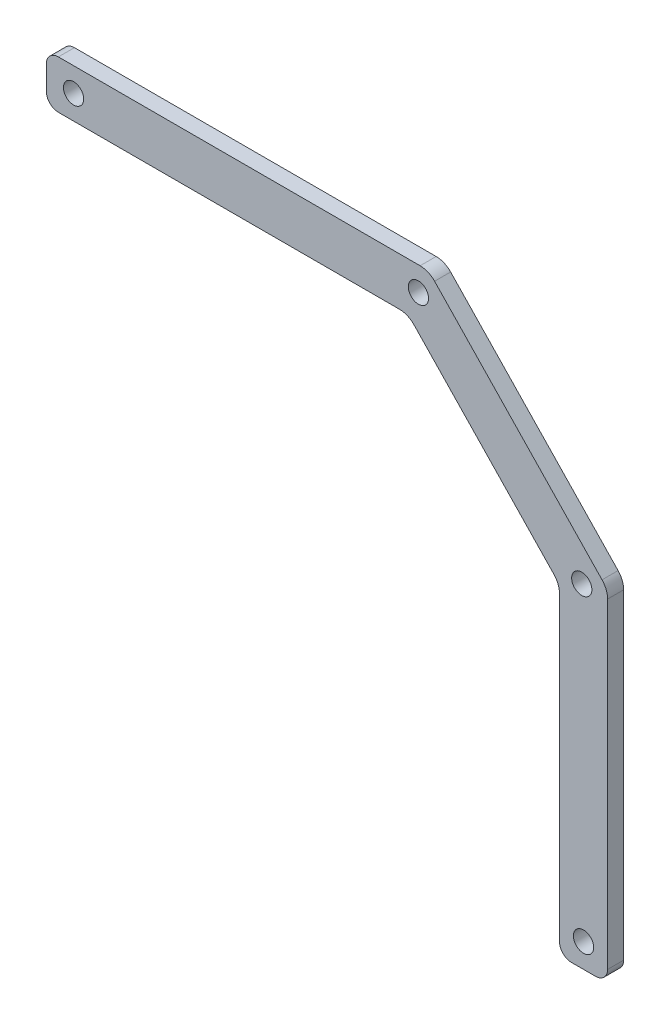
ISO-10303-21;
HEADER;
FILE_DESCRIPTION(('STEP AP214'),'2;1');
FILE_NAME('part.step','',(''),(''),'','','');
FILE_SCHEMA(('AUTOMOTIVE_DESIGN { 1 0 10303 214 1 1 1 1 }'));
ENDSEC;
DATA;
#1=APPLICATION_CONTEXT('core data for automotive mechanical design processes');
#2=APPLICATION_PROTOCOL_DEFINITION('international standard','automotive_design',2000,#1);
#3=PRODUCT_CONTEXT('',#1,'mechanical');
#4=PRODUCT('Part','Part','',(#3));
#5=PRODUCT_RELATED_PRODUCT_CATEGORY('part','',(#4));
#6=PRODUCT_DEFINITION_FORMATION('','',#4);
#7=PRODUCT_DEFINITION_CONTEXT('part definition',#1,'design');
#8=PRODUCT_DEFINITION('design','',#6,#7);
#9=PRODUCT_DEFINITION_SHAPE('','',#8);
#10=(LENGTH_UNIT() NAMED_UNIT(*) SI_UNIT(.MILLI.,.METRE.));
#11=(NAMED_UNIT(*) PLANE_ANGLE_UNIT() SI_UNIT($,.RADIAN.));
#12=(NAMED_UNIT(*) SI_UNIT($,.STERADIAN.) SOLID_ANGLE_UNIT());
#13=UNCERTAINTY_MEASURE_WITH_UNIT(LENGTH_MEASURE(1.E-05),#10,'distance_accuracy_value','');
#14=(GEOMETRIC_REPRESENTATION_CONTEXT(3) GLOBAL_UNCERTAINTY_ASSIGNED_CONTEXT((#13)) GLOBAL_UNIT_ASSIGNED_CONTEXT((#10,
#11,#12)) REPRESENTATION_CONTEXT('',''));
#15=CARTESIAN_POINT('',(0.,0.,0.));
#16=DIRECTION('',(0.,0.,1.));
#17=DIRECTION('',(1.,0.,0.));
#18=AXIS2_PLACEMENT_3D('',#15,#16,#17);
#19=CARTESIAN_POINT('',(70.,-70.,2.));
#20=DIRECTION('',(-1.,0.,0.));
#21=DIRECTION('',(0.,0.,1.));
#22=AXIS2_PLACEMENT_3D('',#19,#20,#21);
#23=PLANE('',#22);
#24=DIRECTION('',(0.,1.,0.));
#25=VECTOR('',#24,1.);
#26=CARTESIAN_POINT('',(70.,-70.,-2.));
#27=LINE('',#26,#25);
#28=CARTESIAN_POINT('',(70.,-67.,-2.));
#29=VERTEX_POINT('',#28);
#30=CARTESIAN_POINT('',(70.,13.0065551866887,-2.));
#31=VERTEX_POINT('',#30);
#32=EDGE_CURVE('E184',#29,#31,#27,.T.);
#33=ORIENTED_EDGE('',*,*,#32,.T.);
#34=DIRECTION('',(0.,0.,-1.));
#35=VECTOR('',#34,1.);
#36=CARTESIAN_POINT('',(70.,13.0065551866887,2.));
#37=LINE('',#36,#35);
#38=CARTESIAN_POINT('',(70.,13.0065551866887,2.));
#39=VERTEX_POINT('',#38);
#40=EDGE_CURVE('E52',#31,#39,#37,.F.);
#41=ORIENTED_EDGE('',*,*,#40,.T.);
#42=DIRECTION('',(0.,1.,0.));
#43=VECTOR('',#42,1.);
#44=CARTESIAN_POINT('',(70.,-70.,2.));
#45=LINE('',#44,#43);
#46=CARTESIAN_POINT('',(70.,-67.,2.));
#47=VERTEX_POINT('',#46);
#48=EDGE_CURVE('E178',#47,#39,#45,.T.);
#49=ORIENTED_EDGE('',*,*,#48,.F.);
#50=DIRECTION('',(0.,0.,-1.));
#51=VECTOR('',#50,1.);
#52=CARTESIAN_POINT('',(70.,-67.,2.));
#53=LINE('',#52,#51);
#54=EDGE_CURVE('E224',#47,#29,#53,.T.);
#55=ORIENTED_EDGE('',*,*,#54,.T.);
#56=EDGE_LOOP('',(#33,#41,#49,#55));
#57=FACE_BOUND('',#56,.T.);
#58=ADVANCED_FACE('F37',(#57),#23,.F.);
#59=CARTESIAN_POINT('',(-70.,-70.,2.));
#60=DIRECTION('',(1.,0.,0.));
#61=DIRECTION('',(0.,0.,-1.));
#62=AXIS2_PLACEMENT_3D('',#59,#60,#61);
#63=PLANE('',#62);
#64=DIRECTION('',(0.,-1.,0.));
#65=VECTOR('',#64,1.);
#66=CARTESIAN_POINT('',(-70.,-70.,2.));
#67=LINE('',#66,#65);
#68=CARTESIAN_POINT('',(-70.,58.6226510998345,2.));
#69=VERTEX_POINT('',#68);
#70=CARTESIAN_POINT('',(-70.,52.6500248397377,2.));
#71=VERTEX_POINT('',#70);
#72=EDGE_CURVE('E181',#69,#71,#67,.T.);
#73=ORIENTED_EDGE('',*,*,#72,.F.);
#74=DIRECTION('',(0.,0.,-1.));
#75=VECTOR('',#74,1.);
#76=CARTESIAN_POINT('',(-70.,58.6226510998345,-2.));
#77=LINE('',#76,#75);
#78=CARTESIAN_POINT('',(-70.,58.6226510998345,-2.));
#79=VERTEX_POINT('',#78);
#80=EDGE_CURVE('E229',#69,#79,#77,.T.);
#81=ORIENTED_EDGE('',*,*,#80,.T.);
#82=DIRECTION('',(0.,-1.,0.));
#83=VECTOR('',#82,1.);
#84=CARTESIAN_POINT('',(-70.,-70.,-2.));
#85=LINE('',#84,#83);
#86=CARTESIAN_POINT('',(-70.,52.6500248397377,-2.));
#87=VERTEX_POINT('',#86);
#88=EDGE_CURVE('E179',#79,#87,#85,.T.);
#89=ORIENTED_EDGE('',*,*,#88,.T.);
#90=DIRECTION('',(0.,0.,-1.));
#91=VECTOR('',#90,1.);
#92=CARTESIAN_POINT('',(-70.,52.6500248397377,2.));
#93=LINE('',#92,#91);
#94=EDGE_CURVE('E227',#87,#71,#93,.F.);
#95=ORIENTED_EDGE('',*,*,#94,.T.);
#96=EDGE_LOOP('',(#73,#81,#89,#95));
#97=FACE_BOUND('',#96,.T.);
#98=ADVANCED_FACE('F339',(#97),#63,.F.);
#99=CARTESIAN_POINT('',(-70.,-70.,2.));
#100=DIRECTION('',(0.,1.,0.));
#101=DIRECTION('',(0.,0.,1.));
#102=AXIS2_PLACEMENT_3D('',#99,#100,#101);
#103=PLANE('',#102);
#104=DIRECTION('',(1.,0.,0.));
#105=VECTOR('',#104,1.);
#106=CARTESIAN_POINT('',(-70.,-70.,2.));
#107=LINE('',#106,#105);
#108=CARTESIAN_POINT('',(61.,-70.,2.));
#109=VERTEX_POINT('',#108);
#110=CARTESIAN_POINT('',(67.,-70.,2.));
#111=VERTEX_POINT('',#110);
#112=EDGE_CURVE('E172',#109,#111,#107,.T.);
#113=ORIENTED_EDGE('',*,*,#112,.F.);
#114=DIRECTION('',(0.,0.,-1.));
#115=VECTOR('',#114,1.);
#116=CARTESIAN_POINT('',(61.,-70.,-2.));
#117=LINE('',#116,#115);
#118=CARTESIAN_POINT('',(61.,-70.,-2.));
#119=VERTEX_POINT('',#118);
#120=EDGE_CURVE('E157',#109,#119,#117,.T.);
#121=ORIENTED_EDGE('',*,*,#120,.T.);
#122=DIRECTION('',(1.,0.,0.));
#123=VECTOR('',#122,1.);
#124=CARTESIAN_POINT('',(-70.,-70.,-2.));
#125=LINE('',#124,#123);
#126=CARTESIAN_POINT('',(67.,-70.,-2.));
#127=VERTEX_POINT('',#126);
#128=EDGE_CURVE('E169',#119,#127,#125,.T.);
#129=ORIENTED_EDGE('',*,*,#128,.T.);
#130=DIRECTION('',(0.,0.,-1.));
#131=VECTOR('',#130,1.);
#132=CARTESIAN_POINT('',(67.,-70.,2.));
#133=LINE('',#132,#131);
#134=EDGE_CURVE('E173',#127,#111,#133,.F.);
#135=ORIENTED_EDGE('',*,*,#134,.T.);
#136=EDGE_LOOP('',(#113,#121,#129,#135));
#137=FACE_BOUND('',#136,.T.);
#138=ADVANCED_FACE('F168',(#137),#103,.F.);
#139=CARTESIAN_POINT('',(0.,0.,2.));
#140=DIRECTION('',(0.,0.,-1.));
#141=DIRECTION('',(-1.,0.,0.));
#142=AXIS2_PLACEMENT_3D('',#139,#140,#141);
#143=PLANE('',#142);
#144=CARTESIAN_POINT('',(63.5511898929703,13.0736254743437,2.));
#145=DIRECTION('',(0.,0.,-1.));
#146=DIRECTION('',(-1.,0.,0.));
#147=AXIS2_PLACEMENT_3D('',#144,#145,#146);
#148=CIRCLE('',#147,2.52499999999999);
#149=CARTESIAN_POINT('',(61.0261898929703,13.0736254743437,2.));
#150=VERTEX_POINT('',#149);
#151=EDGE_CURVE('E192',#150,#150,#148,.T.);
#152=ORIENTED_EDGE('',*,*,#151,.T.);
#153=EDGE_LOOP('',(#152));
#154=FACE_BOUND('',#153,.T.);
#155=CARTESIAN_POINT('',(22.8047446152163,55.6226510998344,2.));
#156=DIRECTION('',(0.,0.,-1.));
#157=DIRECTION('',(-1.,0.,0.));
#158=AXIS2_PLACEMENT_3D('',#155,#156,#157);
#159=CIRCLE('',#158,2.525);
#160=CARTESIAN_POINT('',(20.2797446152163,55.6226510998344,2.));
#161=VERTEX_POINT('',#160);
#162=EDGE_CURVE('E201',#161,#161,#159,.T.);
#163=ORIENTED_EDGE('',*,*,#162,.T.);
#164=EDGE_LOOP('',(#163));
#165=FACE_BOUND('',#164,.T.);
#166=CARTESIAN_POINT('',(-63.2138583550381,55.6500248397377,2.));
#167=DIRECTION('',(0.,0.,-1.));
#168=DIRECTION('',(-1.,0.,0.));
#169=AXIS2_PLACEMENT_3D('',#166,#167,#168);
#170=CIRCLE('',#169,2.52499999999999);
#171=CARTESIAN_POINT('',(-65.7388583550381,55.6500248397377,2.));
#172=VERTEX_POINT('',#171);
#173=EDGE_CURVE('E196',#172,#172,#170,.T.);
#174=ORIENTED_EDGE('',*,*,#173,.T.);
#175=EDGE_LOOP('',(#174));
#176=FACE_BOUND('',#175,.T.);
#177=CARTESIAN_POINT('',(64.,-64.,2.));
#178=DIRECTION('',(0.,0.,-1.));
#179=DIRECTION('',(-1.,0.,0.));
#180=AXIS2_PLACEMENT_3D('',#177,#178,#179);
#181=CIRCLE('',#180,2.52499999999999);
#182=CARTESIAN_POINT('',(61.475,-64.,2.));
#183=VERTEX_POINT('',#182);
#184=EDGE_CURVE('E191',#183,#183,#181,.T.);
#185=ORIENTED_EDGE('',*,*,#184,.T.);
#186=EDGE_LOOP('',(#185));
#187=FACE_BOUND('',#186,.T.);
#188=DIRECTION('',(0.691642489665963,-0.722240033845167,0.));
#189=VECTOR('',#188,1.);
#190=CARTESIAN_POINT('',(44.0143826527052,42.149722768696,2.));
#191=LINE('',#190,#189);
#192=CARTESIAN_POINT('',(26.842890807764,60.0808635481642,2.));
#193=VERTEX_POINT('',#192);
#194=CARTESIAN_POINT('',(68.6112001692258,16.4647676350185,2.));
#195=VERTEX_POINT('',#194);
#196=EDGE_CURVE('E197',#193,#195,#191,.T.);
#197=ORIENTED_EDGE('',*,*,#196,.F.);
#198=CARTESIAN_POINT('',(23.2316906385382,56.6226510998344,2.));
#199=DIRECTION('',(0.,0.,-1.));
#200=DIRECTION('',(-1.,0.,0.));
#201=AXIS2_PLACEMENT_3D('',#198,#199,#200);
#202=CIRCLE('',#201,5.);
#203=CARTESIAN_POINT('',(23.2316906385382,61.6226510998344,2.));
#204=VERTEX_POINT('',#203);
#205=EDGE_CURVE('E260',#193,#204,#202,.F.);
#206=ORIENTED_EDGE('',*,*,#205,.T.);
#207=DIRECTION('',(1.,0.,0.));
#208=VECTOR('',#207,1.);
#209=CARTESIAN_POINT('',(0.,61.6226510998344,2.));
#210=LINE('',#209,#208);
#211=CARTESIAN_POINT('',(-67.,61.6226510998345,2.));
#212=VERTEX_POINT('',#211);
#213=EDGE_CURVE('E296',#212,#204,#210,.T.);
#214=ORIENTED_EDGE('',*,*,#213,.F.);
#215=CARTESIAN_POINT('',(-67.,58.6226510998345,2.));
#216=DIRECTION('',(0.,0.,-1.));
#217=DIRECTION('',(-1.,0.,0.));
#218=AXIS2_PLACEMENT_3D('',#215,#216,#217);
#219=CIRCLE('',#218,3.);
#220=EDGE_CURVE('E241',#212,#69,#219,.F.);
#221=ORIENTED_EDGE('',*,*,#220,.T.);
#222=ORIENTED_EDGE('',*,*,#72,.T.);
#223=CARTESIAN_POINT('',(-67.,52.6500248397377,2.));
#224=DIRECTION('',(0.,0.,-1.));
#225=DIRECTION('',(-1.,0.,0.));
#226=AXIS2_PLACEMENT_3D('',#223,#224,#225);
#227=CIRCLE('',#226,3.);
#228=CARTESIAN_POINT('',(-67.,49.6500248397377,2.));
#229=VERTEX_POINT('',#228);
#230=EDGE_CURVE('E238',#71,#229,#227,.F.);
#231=ORIENTED_EDGE('',*,*,#230,.T.);
#232=DIRECTION('',(-1.,0.,0.));
#233=VECTOR('',#232,1.);
#234=CARTESIAN_POINT('',(0.,49.6500248397377,2.));
#235=LINE('',#234,#233);
#236=CARTESIAN_POINT('',(18.0821243013945,49.6500248397377,2.));
#237=VERTEX_POINT('',#236);
#238=EDGE_CURVE('E290',#237,#229,#235,.T.);
#239=ORIENTED_EDGE('',*,*,#238,.F.);
#240=CARTESIAN_POINT('',(18.0821243013945,44.6500248397377,2.));
#241=DIRECTION('',(0.,0.,-1.));
#242=DIRECTION('',(-1.,0.,0.));
#243=AXIS2_PLACEMENT_3D('',#240,#241,#242);
#244=CIRCLE('',#243,5.);
#245=CARTESIAN_POINT('',(21.6933244706203,48.1082372880675,2.));
#246=VERTEX_POINT('',#245);
#247=EDGE_CURVE('E12',#237,#246,#244,.T.);
#248=ORIENTED_EDGE('',*,*,#247,.T.);
#249=DIRECTION('',(-0.691642489665963,0.722240033845167,0.));
#250=VECTOR('',#249,1.);
#251=CARTESIAN_POINT('',(35.3475022465632,33.8500128927044,2.));
#252=LINE('',#251,#250);
#253=CARTESIAN_POINT('',(56.6112001692258,11.6456310960419,2.));
#254=VERTEX_POINT('',#253);
#255=EDGE_CURVE('E289',#254,#246,#252,.T.);
#256=ORIENTED_EDGE('',*,*,#255,.F.);
#257=CARTESIAN_POINT('',(53.,8.18741864771205,2.));
#258=DIRECTION('',(0.,0.,-1.));
#259=DIRECTION('',(-1.,0.,0.));
#260=AXIS2_PLACEMENT_3D('',#257,#258,#259);
#261=CIRCLE('',#260,5.);
#262=CARTESIAN_POINT('',(58.,8.18741864771205,2.));
#263=VERTEX_POINT('',#262);
#264=EDGE_CURVE('E60',#254,#263,#261,.T.);
#265=ORIENTED_EDGE('',*,*,#264,.T.);
#266=DIRECTION('',(0.,1.,0.));
#267=VECTOR('',#266,1.);
#268=CARTESIAN_POINT('',(58.,0.,2.));
#269=LINE('',#268,#267);
#270=CARTESIAN_POINT('',(58.,-67.,2.));
#271=VERTEX_POINT('',#270);
#272=EDGE_CURVE('E294',#271,#263,#269,.T.);
#273=ORIENTED_EDGE('',*,*,#272,.F.);
#274=CARTESIAN_POINT('',(61.,-67.,2.));
#275=DIRECTION('',(0.,0.,-1.));
#276=DIRECTION('',(-1.,0.,0.));
#277=AXIS2_PLACEMENT_3D('',#274,#275,#276);
#278=CIRCLE('',#277,3.);
#279=EDGE_CURVE('E222',#271,#109,#278,.F.);
#280=ORIENTED_EDGE('',*,*,#279,.T.);
#281=ORIENTED_EDGE('',*,*,#112,.T.);
#282=CARTESIAN_POINT('',(67.,-67.,2.));
#283=DIRECTION('',(0.,0.,-1.));
#284=DIRECTION('',(-1.,0.,0.));
#285=AXIS2_PLACEMENT_3D('',#282,#283,#284);
#286=CIRCLE('',#285,3.);
#287=EDGE_CURVE('E220',#111,#47,#286,.F.);
#288=ORIENTED_EDGE('',*,*,#287,.T.);
#289=ORIENTED_EDGE('',*,*,#48,.T.);
#290=CARTESIAN_POINT('',(65.,13.0065551866887,2.));
#291=DIRECTION('',(0.,0.,-1.));
#292=DIRECTION('',(-1.,0.,0.));
#293=AXIS2_PLACEMENT_3D('',#290,#291,#292);
#294=CIRCLE('',#293,5.);
#295=EDGE_CURVE('E258',#39,#195,#294,.F.);
#296=ORIENTED_EDGE('',*,*,#295,.T.);
#297=EDGE_LOOP('',(#197,#206,#214,#221,#222,#231,#239,#248,#256,#265,#273,#280,#281,#288,#289,#296));
#298=FACE_BOUND('',#297,.T.);
#299=ADVANCED_FACE('F288',(#154,#165,#176,#187,#298),#143,.F.);
#300=CARTESIAN_POINT('',(0.,0.,-2.));
#301=DIRECTION('',(0.,0.,-1.));
#302=DIRECTION('',(-1.,0.,0.));
#303=AXIS2_PLACEMENT_3D('',#300,#301,#302);
#304=PLANE('',#303);
#305=CARTESIAN_POINT('',(63.5511898929703,13.0736254743437,-2.));
#306=DIRECTION('',(0.,0.,-1.));
#307=DIRECTION('',(-1.,0.,0.));
#308=AXIS2_PLACEMENT_3D('',#305,#306,#307);
#309=CIRCLE('',#308,2.52499999999999);
#310=CARTESIAN_POINT('',(61.0261898929703,13.0736254743437,-2.));
#311=VERTEX_POINT('',#310);
#312=EDGE_CURVE('E202',#311,#311,#309,.T.);
#313=ORIENTED_EDGE('',*,*,#312,.F.);
#314=EDGE_LOOP('',(#313));
#315=FACE_BOUND('',#314,.T.);
#316=CARTESIAN_POINT('',(22.8047446152163,55.6226510998344,-2.));
#317=DIRECTION('',(0.,0.,-1.));
#318=DIRECTION('',(-1.,0.,0.));
#319=AXIS2_PLACEMENT_3D('',#316,#317,#318);
#320=CIRCLE('',#319,2.525);
#321=CARTESIAN_POINT('',(20.2797446152163,55.6226510998344,-2.));
#322=VERTEX_POINT('',#321);
#323=EDGE_CURVE('E198',#322,#322,#320,.T.);
#324=ORIENTED_EDGE('',*,*,#323,.F.);
#325=EDGE_LOOP('',(#324));
#326=FACE_BOUND('',#325,.T.);
#327=CARTESIAN_POINT('',(-63.2138583550381,55.6500248397377,-2.));
#328=DIRECTION('',(0.,0.,-1.));
#329=DIRECTION('',(-1.,0.,0.));
#330=AXIS2_PLACEMENT_3D('',#327,#328,#329);
#331=CIRCLE('',#330,2.52499999999999);
#332=CARTESIAN_POINT('',(-65.7388583550381,55.6500248397377,-2.));
#333=VERTEX_POINT('',#332);
#334=EDGE_CURVE('E193',#333,#333,#331,.T.);
#335=ORIENTED_EDGE('',*,*,#334,.F.);
#336=EDGE_LOOP('',(#335));
#337=FACE_BOUND('',#336,.T.);
#338=CARTESIAN_POINT('',(64.,-64.,-2.));
#339=DIRECTION('',(0.,0.,-1.));
#340=DIRECTION('',(-1.,0.,0.));
#341=AXIS2_PLACEMENT_3D('',#338,#339,#340);
#342=CIRCLE('',#341,2.52499999999999);
#343=CARTESIAN_POINT('',(61.475,-64.,-2.));
#344=VERTEX_POINT('',#343);
#345=EDGE_CURVE('E188',#344,#344,#342,.T.);
#346=ORIENTED_EDGE('',*,*,#345,.F.);
#347=EDGE_LOOP('',(#346));
#348=FACE_BOUND('',#347,.T.);
#349=DIRECTION('',(1.,0.,0.));
#350=VECTOR('',#349,1.);
#351=CARTESIAN_POINT('',(0.,61.6226510998344,-2.));
#352=LINE('',#351,#350);
#353=CARTESIAN_POINT('',(-67.,61.6226510998345,-2.));
#354=VERTEX_POINT('',#353);
#355=CARTESIAN_POINT('',(23.2316906385382,61.6226510998344,-2.));
#356=VERTEX_POINT('',#355);
#357=EDGE_CURVE('E212',#354,#356,#352,.T.);
#358=ORIENTED_EDGE('',*,*,#357,.T.);
#359=CARTESIAN_POINT('',(23.2316906385382,56.6226510998344,-2.));
#360=DIRECTION('',(0.,0.,-1.));
#361=DIRECTION('',(-1.,0.,0.));
#362=AXIS2_PLACEMENT_3D('',#359,#360,#361);
#363=CIRCLE('',#362,5.);
#364=CARTESIAN_POINT('',(26.842890807764,60.0808635481642,-2.));
#365=VERTEX_POINT('',#364);
#366=EDGE_CURVE('E251',#356,#365,#363,.T.);
#367=ORIENTED_EDGE('',*,*,#366,.T.);
#368=DIRECTION('',(0.691642489665963,-0.722240033845167,0.));
#369=VECTOR('',#368,1.);
#370=CARTESIAN_POINT('',(44.0143826527052,42.149722768696,-2.));
#371=LINE('',#370,#369);
#372=CARTESIAN_POINT('',(68.6112001692258,16.4647676350185,-2.));
#373=VERTEX_POINT('',#372);
#374=EDGE_CURVE('E214',#365,#373,#371,.T.);
#375=ORIENTED_EDGE('',*,*,#374,.T.);
#376=CARTESIAN_POINT('',(65.,13.0065551866887,-2.));
#377=DIRECTION('',(0.,0.,-1.));
#378=DIRECTION('',(-1.,0.,0.));
#379=AXIS2_PLACEMENT_3D('',#376,#377,#378);
#380=CIRCLE('',#379,5.);
#381=EDGE_CURVE('E249',#373,#31,#380,.T.);
#382=ORIENTED_EDGE('',*,*,#381,.T.);
#383=ORIENTED_EDGE('',*,*,#32,.F.);
#384=CARTESIAN_POINT('',(67.,-67.,-2.));
#385=DIRECTION('',(0.,0.,-1.));
#386=DIRECTION('',(-1.,0.,0.));
#387=AXIS2_PLACEMENT_3D('',#384,#385,#386);
#388=CIRCLE('',#387,3.);
#389=EDGE_CURVE('E163',#29,#127,#388,.T.);
#390=ORIENTED_EDGE('',*,*,#389,.T.);
#391=ORIENTED_EDGE('',*,*,#128,.F.);
#392=CARTESIAN_POINT('',(61.,-67.,-2.));
#393=DIRECTION('',(0.,0.,-1.));
#394=DIRECTION('',(-1.,0.,0.));
#395=AXIS2_PLACEMENT_3D('',#392,#393,#394);
#396=CIRCLE('',#395,3.);
#397=CARTESIAN_POINT('',(58.,-67.,-2.));
#398=VERTEX_POINT('',#397);
#399=EDGE_CURVE('E153',#119,#398,#396,.T.);
#400=ORIENTED_EDGE('',*,*,#399,.T.);
#401=DIRECTION('',(0.,1.,0.));
#402=VECTOR('',#401,1.);
#403=CARTESIAN_POINT('',(58.,0.,-2.));
#404=LINE('',#403,#402);
#405=CARTESIAN_POINT('',(58.,8.18741864771205,-2.));
#406=VERTEX_POINT('',#405);
#407=EDGE_CURVE('E205',#398,#406,#404,.T.);
#408=ORIENTED_EDGE('',*,*,#407,.T.);
#409=CARTESIAN_POINT('',(53.,8.18741864771205,-2.));
#410=DIRECTION('',(0.,0.,-1.));
#411=DIRECTION('',(-1.,0.,0.));
#412=AXIS2_PLACEMENT_3D('',#409,#410,#411);
#413=CIRCLE('',#412,5.);
#414=CARTESIAN_POINT('',(56.6112001692258,11.6456310960419,-2.));
#415=VERTEX_POINT('',#414);
#416=EDGE_CURVE('E273',#406,#415,#413,.F.);
#417=ORIENTED_EDGE('',*,*,#416,.T.);
#418=DIRECTION('',(-0.691642489665963,0.722240033845167,0.));
#419=VECTOR('',#418,1.);
#420=CARTESIAN_POINT('',(35.3475022465632,33.8500128927044,-2.));
#421=LINE('',#420,#419);
#422=CARTESIAN_POINT('',(21.6933244706203,48.1082372880675,-2.));
#423=VERTEX_POINT('',#422);
#424=EDGE_CURVE('E207',#415,#423,#421,.T.);
#425=ORIENTED_EDGE('',*,*,#424,.T.);
#426=CARTESIAN_POINT('',(18.0821243013945,44.6500248397377,-2.));
#427=DIRECTION('',(0.,0.,-1.));
#428=DIRECTION('',(-1.,0.,0.));
#429=AXIS2_PLACEMENT_3D('',#426,#427,#428);
#430=CIRCLE('',#429,5.);
#431=CARTESIAN_POINT('',(18.0821243013945,49.6500248397377,-2.));
#432=VERTEX_POINT('',#431);
#433=EDGE_CURVE('E45',#423,#432,#430,.F.);
#434=ORIENTED_EDGE('',*,*,#433,.T.);
#435=DIRECTION('',(-1.,0.,0.));
#436=VECTOR('',#435,1.);
#437=CARTESIAN_POINT('',(0.,49.6500248397377,-2.));
#438=LINE('',#437,#436);
#439=CARTESIAN_POINT('',(-67.,49.6500248397377,-2.));
#440=VERTEX_POINT('',#439);
#441=EDGE_CURVE('E210',#432,#440,#438,.T.);
#442=ORIENTED_EDGE('',*,*,#441,.T.);
#443=CARTESIAN_POINT('',(-67.,52.6500248397377,-2.));
#444=DIRECTION('',(0.,0.,-1.));
#445=DIRECTION('',(-1.,0.,0.));
#446=AXIS2_PLACEMENT_3D('',#443,#444,#445);
#447=CIRCLE('',#446,3.);
#448=EDGE_CURVE('E232',#440,#87,#447,.T.);
#449=ORIENTED_EDGE('',*,*,#448,.T.);
#450=ORIENTED_EDGE('',*,*,#88,.F.);
#451=CARTESIAN_POINT('',(-67.,58.6226510998345,-2.));
#452=DIRECTION('',(0.,0.,-1.));
#453=DIRECTION('',(-1.,0.,0.));
#454=AXIS2_PLACEMENT_3D('',#451,#452,#453);
#455=CIRCLE('',#454,3.);
#456=EDGE_CURVE('E234',#79,#354,#455,.T.);
#457=ORIENTED_EDGE('',*,*,#456,.T.);
#458=EDGE_LOOP('',(#358,#367,#375,#382,#383,#390,#391,#400,#408,#417,#425,#434,#442,#449,#450,#457));
#459=FACE_BOUND('',#458,.T.);
#460=ADVANCED_FACE('F176',(#315,#326,#337,#348,#459),#304,.T.);
#461=CARTESIAN_POINT('',(64.,-64.,-10.));
#462=DIRECTION('',(0.,0.,1.));
#463=DIRECTION('',(1.,0.,0.));
#464=AXIS2_PLACEMENT_3D('',#461,#462,#463);
#465=CYLINDRICAL_SURFACE('',#464,2.52499999999999);
#466=ORIENTED_EDGE('',*,*,#345,.T.);
#467=EDGE_LOOP('',(#466));
#468=FACE_BOUND('',#467,.T.);
#469=ORIENTED_EDGE('',*,*,#184,.F.);
#470=EDGE_LOOP('',(#469));
#471=FACE_BOUND('',#470,.T.);
#472=ADVANCED_FACE('F439',(#468,#471),#465,.F.);
#473=CARTESIAN_POINT('',(-63.2138583550381,55.6500248397377,-15.));
#474=DIRECTION('',(0.,0.,1.));
#475=DIRECTION('',(1.,0.,0.));
#476=AXIS2_PLACEMENT_3D('',#473,#474,#475);
#477=CYLINDRICAL_SURFACE('',#476,2.52499999999999);
#478=ORIENTED_EDGE('',*,*,#334,.T.);
#479=EDGE_LOOP('',(#478));
#480=FACE_BOUND('',#479,.T.);
#481=ORIENTED_EDGE('',*,*,#173,.F.);
#482=EDGE_LOOP('',(#481));
#483=FACE_BOUND('',#482,.T.);
#484=ADVANCED_FACE('F502',(#480,#483),#477,.F.);
#485=CARTESIAN_POINT('',(22.8047446152163,55.6226510998344,-15.));
#486=DIRECTION('',(0.,0.,1.));
#487=DIRECTION('',(1.,0.,0.));
#488=AXIS2_PLACEMENT_3D('',#485,#486,#487);
#489=CYLINDRICAL_SURFACE('',#488,2.525);
#490=ORIENTED_EDGE('',*,*,#323,.T.);
#491=EDGE_LOOP('',(#490));
#492=FACE_BOUND('',#491,.T.);
#493=ORIENTED_EDGE('',*,*,#162,.F.);
#494=EDGE_LOOP('',(#493));
#495=FACE_BOUND('',#494,.T.);
#496=ADVANCED_FACE('F492',(#492,#495),#489,.F.);
#497=CARTESIAN_POINT('',(63.5511898929703,13.0736254743437,-15.));
#498=DIRECTION('',(0.,0.,1.));
#499=DIRECTION('',(1.,0.,0.));
#500=AXIS2_PLACEMENT_3D('',#497,#498,#499);
#501=CYLINDRICAL_SURFACE('',#500,2.52499999999999);
#502=ORIENTED_EDGE('',*,*,#312,.T.);
#503=EDGE_LOOP('',(#502));
#504=FACE_BOUND('',#503,.T.);
#505=ORIENTED_EDGE('',*,*,#151,.F.);
#506=EDGE_LOOP('',(#505));
#507=FACE_BOUND('',#506,.T.);
#508=ADVANCED_FACE('F428',(#504,#507),#501,.F.);
#509=CARTESIAN_POINT('',(58.,-70.,20.));
#510=DIRECTION('',(-1.,0.,0.));
#511=DIRECTION('',(0.,-1.,0.));
#512=AXIS2_PLACEMENT_3D('',#509,#510,#511);
#513=PLANE('',#512);
#514=ORIENTED_EDGE('',*,*,#272,.T.);
#515=DIRECTION('',(0.,0.,-1.));
#516=VECTOR('',#515,1.);
#517=CARTESIAN_POINT('',(58.,8.18741864771205,-2.));
#518=LINE('',#517,#516);
#519=EDGE_CURVE('E263',#263,#406,#518,.T.);
#520=ORIENTED_EDGE('',*,*,#519,.T.);
#521=ORIENTED_EDGE('',*,*,#407,.F.);
#522=DIRECTION('',(0.,0.,-1.));
#523=VECTOR('',#522,1.);
#524=CARTESIAN_POINT('',(58.,-67.,2.));
#525=LINE('',#524,#523);
#526=EDGE_CURVE('E158',#398,#271,#525,.F.);
#527=ORIENTED_EDGE('',*,*,#526,.T.);
#528=EDGE_LOOP('',(#514,#520,#521,#527));
#529=FACE_BOUND('',#528,.T.);
#530=ADVANCED_FACE('F370',(#529),#513,.T.);
#531=CARTESIAN_POINT('',(58.,10.195392205619,20.));
#532=DIRECTION('',(-0.722240033845167,-0.691642489665963,0.));
#533=DIRECTION('',(0.691642489665963,-0.722240033845167,0.));
#534=AXIS2_PLACEMENT_3D('',#531,#532,#533);
#535=PLANE('',#534);
#536=ORIENTED_EDGE('',*,*,#424,.F.);
#537=DIRECTION('',(0.,0.,-1.));
#538=VECTOR('',#537,1.);
#539=CARTESIAN_POINT('',(56.6112001692258,11.6456310960419,2.));
#540=LINE('',#539,#538);
#541=EDGE_CURVE('E269',#415,#254,#540,.F.);
#542=ORIENTED_EDGE('',*,*,#541,.T.);
#543=ORIENTED_EDGE('',*,*,#255,.T.);
#544=DIRECTION('',(0.,0.,-1.));
#545=VECTOR('',#544,1.);
#546=CARTESIAN_POINT('',(21.6933244706203,48.1082372880675,-2.));
#547=LINE('',#546,#545);
#548=EDGE_CURVE('E266',#246,#423,#547,.T.);
#549=ORIENTED_EDGE('',*,*,#548,.T.);
#550=EDGE_LOOP('',(#536,#542,#543,#549));
#551=FACE_BOUND('',#550,.T.);
#552=ADVANCED_FACE('F292',(#551),#535,.T.);
#553=CARTESIAN_POINT('',(20.2168544180037,49.6500248397377,20.));
#554=DIRECTION('',(0.,-1.,0.));
#555=DIRECTION('',(0.,0.,-1.));
#556=AXIS2_PLACEMENT_3D('',#553,#554,#555);
#557=PLANE('',#556);
#558=ORIENTED_EDGE('',*,*,#441,.F.);
#559=DIRECTION('',(0.,0.,-1.));
#560=VECTOR('',#559,1.);
#561=CARTESIAN_POINT('',(18.0821243013945,49.6500248397377,2.));
#562=LINE('',#561,#560);
#563=EDGE_CURVE('E271',#432,#237,#562,.F.);
#564=ORIENTED_EDGE('',*,*,#563,.T.);
#565=ORIENTED_EDGE('',*,*,#238,.T.);
#566=DIRECTION('',(0.,0.,-1.));
#567=VECTOR('',#566,1.);
#568=CARTESIAN_POINT('',(-67.,49.6500248397377,-2.));
#569=LINE('',#568,#567);
#570=EDGE_CURVE('E243',#229,#440,#569,.T.);
#571=ORIENTED_EDGE('',*,*,#570,.T.);
#572=EDGE_LOOP('',(#558,#564,#565,#571));
#573=FACE_BOUND('',#572,.T.);
#574=ADVANCED_FACE('F282',(#573),#557,.T.);
#575=CARTESIAN_POINT('',(25.3664207551475,61.6226510998344,20.));
#576=DIRECTION('',(0.722240033845167,0.691642489665963,0.));
#577=DIRECTION('',(-0.691642489665963,0.722240033845167,0.));
#578=AXIS2_PLACEMENT_3D('',#575,#576,#577);
#579=PLANE('',#578);
#580=ORIENTED_EDGE('',*,*,#374,.F.);
#581=DIRECTION('',(0.,0.,-1.));
#582=VECTOR('',#581,1.);
#583=CARTESIAN_POINT('',(26.842890807764,60.0808635481642,20.));
#584=LINE('',#583,#582);
#585=EDGE_CURVE('E256',#365,#193,#584,.F.);
#586=ORIENTED_EDGE('',*,*,#585,.T.);
#587=ORIENTED_EDGE('',*,*,#196,.T.);
#588=DIRECTION('',(0.,0.,-1.));
#589=VECTOR('',#588,1.);
#590=CARTESIAN_POINT('',(68.6112001692258,16.4647676350185,-2.));
#591=LINE('',#590,#589);
#592=EDGE_CURVE('E253',#195,#373,#591,.T.);
#593=ORIENTED_EDGE('',*,*,#592,.T.);
#594=EDGE_LOOP('',(#580,#586,#587,#593));
#595=FACE_BOUND('',#594,.T.);
#596=ADVANCED_FACE('F322',(#595),#579,.T.);
#597=CARTESIAN_POINT('',(-70.,61.6226510998345,20.));
#598=DIRECTION('',(0.,1.,0.));
#599=DIRECTION('',(-1.,0.,0.));
#600=AXIS2_PLACEMENT_3D('',#597,#598,#599);
#601=PLANE('',#600);
#602=ORIENTED_EDGE('',*,*,#213,.T.);
#603=DIRECTION('',(0.,0.,-1.));
#604=VECTOR('',#603,1.);
#605=CARTESIAN_POINT('',(23.2316906385382,61.6226510998344,20.));
#606=LINE('',#605,#604);
#607=EDGE_CURVE('E246',#204,#356,#606,.T.);
#608=ORIENTED_EDGE('',*,*,#607,.T.);
#609=ORIENTED_EDGE('',*,*,#357,.F.);
#610=DIRECTION('',(0.,0.,-1.));
#611=VECTOR('',#610,1.);
#612=CARTESIAN_POINT('',(-67.,61.6226510998345,2.));
#613=LINE('',#612,#611);
#614=EDGE_CURVE('E236',#354,#212,#613,.F.);
#615=ORIENTED_EDGE('',*,*,#614,.T.);
#616=EDGE_LOOP('',(#602,#608,#609,#615));
#617=FACE_BOUND('',#616,.T.);
#618=ADVANCED_FACE('F330',(#617),#601,.T.);
#619=CARTESIAN_POINT('',(61.,-67.,2.));
#620=DIRECTION('',(0.,0.,1.));
#621=DIRECTION('',(1.,0.,0.));
#622=AXIS2_PLACEMENT_3D('',#619,#620,#621);
#623=CYLINDRICAL_SURFACE('',#622,3.);
#624=ORIENTED_EDGE('',*,*,#279,.F.);
#625=ORIENTED_EDGE('',*,*,#526,.F.);
#626=ORIENTED_EDGE('',*,*,#399,.F.);
#627=ORIENTED_EDGE('',*,*,#120,.F.);
#628=EDGE_LOOP('',(#624,#625,#626,#627));
#629=FACE_BOUND('',#628,.T.);
#630=ADVANCED_FACE('F156',(#629),#623,.T.);
#631=CARTESIAN_POINT('',(67.,-67.,2.));
#632=DIRECTION('',(0.,0.,-1.));
#633=DIRECTION('',(-1.,0.,0.));
#634=AXIS2_PLACEMENT_3D('',#631,#632,#633);
#635=CYLINDRICAL_SURFACE('',#634,3.);
#636=ORIENTED_EDGE('',*,*,#287,.F.);
#637=ORIENTED_EDGE('',*,*,#134,.F.);
#638=ORIENTED_EDGE('',*,*,#389,.F.);
#639=ORIENTED_EDGE('',*,*,#54,.F.);
#640=EDGE_LOOP('',(#636,#637,#638,#639));
#641=FACE_BOUND('',#640,.T.);
#642=ADVANCED_FACE('F351',(#641),#635,.T.);
#643=CARTESIAN_POINT('',(-67.,58.6226510998345,2.));
#644=DIRECTION('',(0.,0.,1.));
#645=DIRECTION('',(1.,0.,0.));
#646=AXIS2_PLACEMENT_3D('',#643,#644,#645);
#647=CYLINDRICAL_SURFACE('',#646,3.);
#648=ORIENTED_EDGE('',*,*,#220,.F.);
#649=ORIENTED_EDGE('',*,*,#614,.F.);
#650=ORIENTED_EDGE('',*,*,#456,.F.);
#651=ORIENTED_EDGE('',*,*,#80,.F.);
#652=EDGE_LOOP('',(#648,#649,#650,#651));
#653=FACE_BOUND('',#652,.T.);
#654=ADVANCED_FACE('F334',(#653),#647,.T.);
#655=CARTESIAN_POINT('',(-67.,52.6500248397377,20.));
#656=DIRECTION('',(0.,0.,1.));
#657=DIRECTION('',(1.,0.,0.));
#658=AXIS2_PLACEMENT_3D('',#655,#656,#657);
#659=CYLINDRICAL_SURFACE('',#658,3.);
#660=ORIENTED_EDGE('',*,*,#230,.F.);
#661=ORIENTED_EDGE('',*,*,#94,.F.);
#662=ORIENTED_EDGE('',*,*,#448,.F.);
#663=ORIENTED_EDGE('',*,*,#570,.F.);
#664=EDGE_LOOP('',(#660,#661,#662,#663));
#665=FACE_BOUND('',#664,.T.);
#666=ADVANCED_FACE('F343',(#665),#659,.T.);
#667=CARTESIAN_POINT('',(23.2316906385382,56.6226510998344,20.));
#668=DIRECTION('',(0.,0.,-1.));
#669=DIRECTION('',(-1.,0.,0.));
#670=AXIS2_PLACEMENT_3D('',#667,#668,#669);
#671=CYLINDRICAL_SURFACE('',#670,5.);
#672=ORIENTED_EDGE('',*,*,#205,.F.);
#673=ORIENTED_EDGE('',*,*,#585,.F.);
#674=ORIENTED_EDGE('',*,*,#366,.F.);
#675=ORIENTED_EDGE('',*,*,#607,.F.);
#676=EDGE_LOOP('',(#672,#673,#674,#675));
#677=FACE_BOUND('',#676,.T.);
#678=ADVANCED_FACE('F325',(#677),#671,.T.);
#679=CARTESIAN_POINT('',(65.,13.0065551866887,20.));
#680=DIRECTION('',(0.,0.,1.));
#681=DIRECTION('',(1.,0.,0.));
#682=AXIS2_PLACEMENT_3D('',#679,#680,#681);
#683=CYLINDRICAL_SURFACE('',#682,5.);
#684=ORIENTED_EDGE('',*,*,#295,.F.);
#685=ORIENTED_EDGE('',*,*,#40,.F.);
#686=ORIENTED_EDGE('',*,*,#381,.F.);
#687=ORIENTED_EDGE('',*,*,#592,.F.);
#688=EDGE_LOOP('',(#684,#685,#686,#687));
#689=FACE_BOUND('',#688,.T.);
#690=ADVANCED_FACE('F317',(#689),#683,.T.);
#691=CARTESIAN_POINT('',(53.,8.18741864771205,20.));
#692=DIRECTION('',(0.,0.,1.));
#693=DIRECTION('',(1.,0.,0.));
#694=AXIS2_PLACEMENT_3D('',#691,#692,#693);
#695=CYLINDRICAL_SURFACE('',#694,5.);
#696=ORIENTED_EDGE('',*,*,#264,.F.);
#697=ORIENTED_EDGE('',*,*,#541,.F.);
#698=ORIENTED_EDGE('',*,*,#416,.F.);
#699=ORIENTED_EDGE('',*,*,#519,.F.);
#700=EDGE_LOOP('',(#696,#697,#698,#699));
#701=FACE_BOUND('',#700,.T.);
#702=ADVANCED_FACE('F372',(#701),#695,.F.);
#703=CARTESIAN_POINT('',(18.0821243013945,44.6500248397377,20.));
#704=DIRECTION('',(0.,0.,1.));
#705=DIRECTION('',(1.,0.,0.));
#706=AXIS2_PLACEMENT_3D('',#703,#704,#705);
#707=CYLINDRICAL_SURFACE('',#706,5.);
#708=ORIENTED_EDGE('',*,*,#247,.F.);
#709=ORIENTED_EDGE('',*,*,#563,.F.);
#710=ORIENTED_EDGE('',*,*,#433,.F.);
#711=ORIENTED_EDGE('',*,*,#548,.F.);
#712=EDGE_LOOP('',(#708,#709,#710,#711));
#713=FACE_BOUND('',#712,.T.);
#714=ADVANCED_FACE('F39',(#713),#707,.F.);
#715=CLOSED_SHELL('',(#58,#98,#138,#299,#460,#472,#484,#496,#508,#530,#552,#574,#596,#618,#630,
#642,#654,#666,#678,#690,#702,#714));
#716=MANIFOLD_SOLID_BREP('B2',#715);
#717=ADVANCED_BREP_SHAPE_REPRESENTATION('',(#18,#716),#14);
#718=SHAPE_DEFINITION_REPRESENTATION(#9,#717);
ENDSEC;
END-ISO-10303-21;
